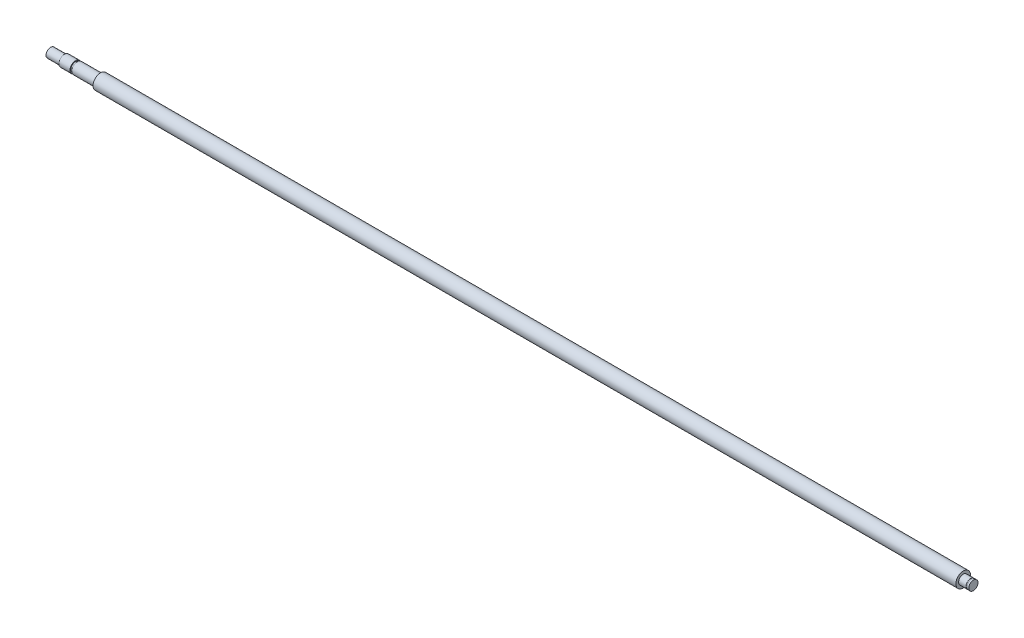
ISO-10303-21;
HEADER;
FILE_DESCRIPTION(('STEP AP214'),'2;1');
FILE_NAME('part.step','',(''),(''),'','','');
FILE_SCHEMA(('AUTOMOTIVE_DESIGN { 1 0 10303 214 1 1 1 1 }'));
ENDSEC;
DATA;
#1=APPLICATION_CONTEXT('core data for automotive mechanical design processes');
#2=APPLICATION_PROTOCOL_DEFINITION('international standard','automotive_design',2000,#1);
#3=PRODUCT_CONTEXT('',#1,'mechanical');
#4=PRODUCT('Part','Part','',(#3));
#5=PRODUCT_RELATED_PRODUCT_CATEGORY('part','',(#4));
#6=PRODUCT_DEFINITION_FORMATION('','',#4);
#7=PRODUCT_DEFINITION_CONTEXT('part definition',#1,'design');
#8=PRODUCT_DEFINITION('design','',#6,#7);
#9=PRODUCT_DEFINITION_SHAPE('','',#8);
#10=(LENGTH_UNIT() NAMED_UNIT(*) SI_UNIT(.MILLI.,.METRE.));
#11=(NAMED_UNIT(*) PLANE_ANGLE_UNIT() SI_UNIT($,.RADIAN.));
#12=(NAMED_UNIT(*) SI_UNIT($,.STERADIAN.) SOLID_ANGLE_UNIT());
#13=UNCERTAINTY_MEASURE_WITH_UNIT(LENGTH_MEASURE(1.E-05),#10,'distance_accuracy_value','');
#14=(GEOMETRIC_REPRESENTATION_CONTEXT(3) GLOBAL_UNCERTAINTY_ASSIGNED_CONTEXT((#13)) GLOBAL_UNIT_ASSIGNED_CONTEXT((#10,
#11,#12)) REPRESENTATION_CONTEXT('',''));
#15=CARTESIAN_POINT('',(0.,0.,0.));
#16=DIRECTION('',(0.,0.,1.));
#17=DIRECTION('',(1.,0.,0.));
#18=AXIS2_PLACEMENT_3D('',#15,#16,#17);
#19=CARTESIAN_POINT('',(-54.,5.00000000000005,0.));
#20=DIRECTION('',(1.,0.,0.));
#21=DIRECTION('',(0.,0.,-1.));
#22=AXIS2_PLACEMENT_3D('',#19,#20,#21);
#23=PLANE('',#22);
#24=CARTESIAN_POINT('',(-54.,0.,0.));
#25=DIRECTION('',(-1.,0.,0.));
#26=DIRECTION('',(0.,0.,1.));
#27=AXIS2_PLACEMENT_3D('',#24,#25,#26);
#28=CIRCLE('',#27,5.00000000000005);
#29=CARTESIAN_POINT('',(-54.,0.,5.00000000000005));
#30=VERTEX_POINT('',#29);
#31=EDGE_CURVE('E87',#30,#30,#28,.T.);
#32=ORIENTED_EDGE('',*,*,#31,.T.);
#33=EDGE_LOOP('',(#32));
#34=FACE_BOUND('',#33,.T.);
#35=ADVANCED_FACE('F35',(#34),#23,.F.);
#36=CARTESIAN_POINT('',(946.,0.,0.));
#37=DIRECTION('',(-1.,0.,0.));
#38=DIRECTION('',(0.,0.,1.));
#39=AXIS2_PLACEMENT_3D('',#36,#37,#38);
#40=PLANE('',#39);
#41=CARTESIAN_POINT('',(946.,0.,0.));
#42=DIRECTION('',(-1.,0.,0.));
#43=DIRECTION('',(0.,0.,1.));
#44=AXIS2_PLACEMENT_3D('',#41,#42,#43);
#45=CIRCLE('',#44,5.00000000000017);
#46=CARTESIAN_POINT('',(946.,0.,5.00000000000017));
#47=VERTEX_POINT('',#46);
#48=EDGE_CURVE('E10',#47,#47,#45,.T.);
#49=ORIENTED_EDGE('',*,*,#48,.F.);
#50=EDGE_LOOP('',(#49));
#51=FACE_BOUND('',#50,.T.);
#52=ADVANCED_FACE('F177',(#51),#40,.F.);
#53=CARTESIAN_POINT('',(-54.,0.,0.));
#54=DIRECTION('',(-1.,0.,0.));
#55=DIRECTION('',(0.,0.,1.));
#56=AXIS2_PLACEMENT_3D('',#53,#54,#55);
#57=CYLINDRICAL_SURFACE('',#56,5.00000000000017);
#58=CARTESIAN_POINT('',(944.15,0.,0.));
#59=DIRECTION('',(-1.,0.,0.));
#60=DIRECTION('',(0.,0.,1.));
#61=AXIS2_PLACEMENT_3D('',#58,#59,#60);
#62=CIRCLE('',#61,5.00000000000017);
#63=CARTESIAN_POINT('',(944.15,0.,5.00000000000017));
#64=VERTEX_POINT('',#63);
#65=EDGE_CURVE('E41',#64,#64,#62,.T.);
#66=ORIENTED_EDGE('',*,*,#65,.F.);
#67=EDGE_LOOP('',(#66));
#68=FACE_BOUND('',#67,.T.);
#69=ORIENTED_EDGE('',*,*,#48,.T.);
#70=EDGE_LOOP('',(#69));
#71=FACE_BOUND('',#70,.T.);
#72=ADVANCED_FACE('F172',(#68,#71),#57,.T.);
#73=CARTESIAN_POINT('',(944.15,5.00000000000017,0.));
#74=DIRECTION('',(1.,0.,0.));
#75=DIRECTION('',(0.,0.,-1.));
#76=AXIS2_PLACEMENT_3D('',#73,#74,#75);
#77=PLANE('',#76);
#78=CARTESIAN_POINT('',(944.15,0.,0.));
#79=DIRECTION('',(-1.,0.,0.));
#80=DIRECTION('',(0.,0.,1.));
#81=AXIS2_PLACEMENT_3D('',#78,#79,#80);
#82=CIRCLE('',#81,4.80000000000012);
#83=CARTESIAN_POINT('',(944.15,0.,4.80000000000012));
#84=VERTEX_POINT('',#83);
#85=EDGE_CURVE('E45',#84,#84,#82,.T.);
#86=ORIENTED_EDGE('',*,*,#85,.F.);
#87=EDGE_LOOP('',(#86));
#88=FACE_BOUND('',#87,.T.);
#89=ORIENTED_EDGE('',*,*,#65,.T.);
#90=EDGE_LOOP('',(#89));
#91=FACE_BOUND('',#90,.T.);
#92=ADVANCED_FACE('F167',(#88,#91),#77,.F.);
#93=CARTESIAN_POINT('',(-54.,0.,0.));
#94=DIRECTION('',(-1.,0.,0.));
#95=DIRECTION('',(0.,0.,1.));
#96=AXIS2_PLACEMENT_3D('',#93,#94,#95);
#97=CYLINDRICAL_SURFACE('',#96,4.80000000000012);
#98=CARTESIAN_POINT('',(943.,0.,0.));
#99=DIRECTION('',(-1.,0.,0.));
#100=DIRECTION('',(0.,0.,1.));
#101=AXIS2_PLACEMENT_3D('',#98,#99,#100);
#102=CIRCLE('',#101,4.80000000000012);
#103=CARTESIAN_POINT('',(943.,0.,4.80000000000012));
#104=VERTEX_POINT('',#103);
#105=EDGE_CURVE('E49',#104,#104,#102,.T.);
#106=ORIENTED_EDGE('',*,*,#105,.F.);
#107=EDGE_LOOP('',(#106));
#108=FACE_BOUND('',#107,.T.);
#109=ORIENTED_EDGE('',*,*,#85,.T.);
#110=EDGE_LOOP('',(#109));
#111=FACE_BOUND('',#110,.T.);
#112=ADVANCED_FACE('F161',(#108,#111),#97,.T.);
#113=CARTESIAN_POINT('',(943.,4.80000000000012,0.));
#114=DIRECTION('',(-1.,0.,0.));
#115=DIRECTION('',(0.,0.,1.));
#116=AXIS2_PLACEMENT_3D('',#113,#114,#115);
#117=PLANE('',#116);
#118=CARTESIAN_POINT('',(943.,0.,0.));
#119=DIRECTION('',(-1.,0.,0.));
#120=DIRECTION('',(0.,0.,1.));
#121=AXIS2_PLACEMENT_3D('',#118,#119,#120);
#122=CIRCLE('',#121,5.00000000000017);
#123=CARTESIAN_POINT('',(943.,0.,5.00000000000017));
#124=VERTEX_POINT('',#123);
#125=EDGE_CURVE('E54',#124,#124,#122,.T.);
#126=ORIENTED_EDGE('',*,*,#125,.F.);
#127=EDGE_LOOP('',(#126));
#128=FACE_BOUND('',#127,.T.);
#129=ORIENTED_EDGE('',*,*,#105,.T.);
#130=EDGE_LOOP('',(#129));
#131=FACE_BOUND('',#130,.T.);
#132=ADVANCED_FACE('F155',(#128,#131),#117,.F.);
#133=CARTESIAN_POINT('',(-54.,0.,0.));
#134=DIRECTION('',(-1.,0.,0.));
#135=DIRECTION('',(0.,0.,1.));
#136=AXIS2_PLACEMENT_3D('',#133,#134,#135);
#137=CYLINDRICAL_SURFACE('',#136,5.00000000000017);
#138=CARTESIAN_POINT('',(935.,0.,0.));
#139=DIRECTION('',(-1.,0.,0.));
#140=DIRECTION('',(0.,0.,1.));
#141=AXIS2_PLACEMENT_3D('',#138,#139,#140);
#142=CIRCLE('',#141,5.00000000000017);
#143=CARTESIAN_POINT('',(935.,0.,5.00000000000017));
#144=VERTEX_POINT('',#143);
#145=EDGE_CURVE('E57',#144,#144,#142,.T.);
#146=ORIENTED_EDGE('',*,*,#145,.F.);
#147=EDGE_LOOP('',(#146));
#148=FACE_BOUND('',#147,.T.);
#149=ORIENTED_EDGE('',*,*,#125,.T.);
#150=EDGE_LOOP('',(#149));
#151=FACE_BOUND('',#150,.T.);
#152=ADVANCED_FACE('F149',(#148,#151),#137,.T.);
#153=CARTESIAN_POINT('',(935.,5.00000000000017,0.));
#154=DIRECTION('',(-1.,0.,0.));
#155=DIRECTION('',(0.,0.,1.));
#156=AXIS2_PLACEMENT_3D('',#153,#154,#155);
#157=PLANE('',#156);
#158=CARTESIAN_POINT('',(935.,0.,0.));
#159=DIRECTION('',(-1.,0.,0.));
#160=DIRECTION('',(0.,0.,1.));
#161=AXIS2_PLACEMENT_3D('',#158,#159,#160);
#162=CIRCLE('',#161,8.00000000000005);
#163=CARTESIAN_POINT('',(935.,0.,8.00000000000005));
#164=VERTEX_POINT('',#163);
#165=EDGE_CURVE('E60',#164,#164,#162,.T.);
#166=ORIENTED_EDGE('',*,*,#165,.F.);
#167=EDGE_LOOP('',(#166));
#168=FACE_BOUND('',#167,.T.);
#169=ORIENTED_EDGE('',*,*,#145,.T.);
#170=EDGE_LOOP('',(#169));
#171=FACE_BOUND('',#170,.T.);
#172=ADVANCED_FACE('F143',(#168,#171),#157,.F.);
#173=CARTESIAN_POINT('',(-54.,0.,0.));
#174=DIRECTION('',(-1.,0.,0.));
#175=DIRECTION('',(0.,0.,1.));
#176=AXIS2_PLACEMENT_3D('',#173,#174,#175);
#177=CYLINDRICAL_SURFACE('',#176,8.);
#178=CARTESIAN_POINT('',(0.,0.,0.));
#179=DIRECTION('',(-1.,0.,0.));
#180=DIRECTION('',(0.,0.,1.));
#181=AXIS2_PLACEMENT_3D('',#178,#179,#180);
#182=CIRCLE('',#181,7.99999999999994);
#183=CARTESIAN_POINT('',(0.,0.,7.99999999999994));
#184=VERTEX_POINT('',#183);
#185=EDGE_CURVE('E63',#184,#184,#182,.T.);
#186=ORIENTED_EDGE('',*,*,#185,.F.);
#187=EDGE_LOOP('',(#186));
#188=FACE_BOUND('',#187,.T.);
#189=ORIENTED_EDGE('',*,*,#165,.T.);
#190=EDGE_LOOP('',(#189));
#191=FACE_BOUND('',#190,.T.);
#192=ADVANCED_FACE('F137',(#188,#191),#177,.T.);
#193=CARTESIAN_POINT('',(0.,7.99999999999994,0.));
#194=DIRECTION('',(1.,0.,0.));
#195=DIRECTION('',(0.,0.,-1.));
#196=AXIS2_PLACEMENT_3D('',#193,#194,#195);
#197=PLANE('',#196);
#198=CARTESIAN_POINT('',(0.,0.,0.));
#199=DIRECTION('',(-1.,0.,0.));
#200=DIRECTION('',(0.,0.,1.));
#201=AXIS2_PLACEMENT_3D('',#198,#199,#200);
#202=CIRCLE('',#201,6.00000000000006);
#203=CARTESIAN_POINT('',(0.,0.,6.00000000000006));
#204=VERTEX_POINT('',#203);
#205=EDGE_CURVE('E66',#204,#204,#202,.T.);
#206=ORIENTED_EDGE('',*,*,#205,.F.);
#207=EDGE_LOOP('',(#206));
#208=FACE_BOUND('',#207,.T.);
#209=ORIENTED_EDGE('',*,*,#185,.T.);
#210=EDGE_LOOP('',(#209));
#211=FACE_BOUND('',#210,.T.);
#212=ADVANCED_FACE('F131',(#208,#211),#197,.F.);
#213=CARTESIAN_POINT('',(-54.,0.,0.));
#214=DIRECTION('',(-1.,0.,0.));
#215=DIRECTION('',(0.,0.,1.));
#216=AXIS2_PLACEMENT_3D('',#213,#214,#215);
#217=CYLINDRICAL_SURFACE('',#216,6.00000000000006);
#218=CARTESIAN_POINT('',(-25.,0.,0.));
#219=DIRECTION('',(-1.,0.,0.));
#220=DIRECTION('',(0.,0.,1.));
#221=AXIS2_PLACEMENT_3D('',#218,#219,#220);
#222=CIRCLE('',#221,6.00000000000006);
#223=CARTESIAN_POINT('',(-25.,0.,6.00000000000006));
#224=VERTEX_POINT('',#223);
#225=EDGE_CURVE('E69',#224,#224,#222,.T.);
#226=ORIENTED_EDGE('',*,*,#225,.F.);
#227=EDGE_LOOP('',(#226));
#228=FACE_BOUND('',#227,.T.);
#229=ORIENTED_EDGE('',*,*,#205,.T.);
#230=EDGE_LOOP('',(#229));
#231=FACE_BOUND('',#230,.T.);
#232=ADVANCED_FACE('F125',(#228,#231),#217,.T.);
#233=CARTESIAN_POINT('',(-25.,6.00000000000006,0.));
#234=DIRECTION('',(1.,0.,0.));
#235=DIRECTION('',(0.,0.,-1.));
#236=AXIS2_PLACEMENT_3D('',#233,#234,#235);
#237=PLANE('',#236);
#238=CARTESIAN_POINT('',(-25.,0.,0.));
#239=DIRECTION('',(-1.,0.,0.));
#240=DIRECTION('',(0.,0.,1.));
#241=AXIS2_PLACEMENT_3D('',#238,#239,#240);
#242=CIRCLE('',#241,5.00000000000006);
#243=CARTESIAN_POINT('',(-25.,0.,5.00000000000006));
#244=VERTEX_POINT('',#243);
#245=EDGE_CURVE('E72',#244,#244,#242,.T.);
#246=ORIENTED_EDGE('',*,*,#245,.F.);
#247=EDGE_LOOP('',(#246));
#248=FACE_BOUND('',#247,.T.);
#249=ORIENTED_EDGE('',*,*,#225,.T.);
#250=EDGE_LOOP('',(#249));
#251=FACE_BOUND('',#250,.T.);
#252=ADVANCED_FACE('F119',(#248,#251),#237,.F.);
#253=CARTESIAN_POINT('',(-54.,0.,0.));
#254=DIRECTION('',(-1.,0.,0.));
#255=DIRECTION('',(0.,0.,1.));
#256=AXIS2_PLACEMENT_3D('',#253,#254,#255);
#257=CYLINDRICAL_SURFACE('',#256,5.00000000000006);
#258=CARTESIAN_POINT('',(-27.,0.,0.));
#259=DIRECTION('',(-1.,0.,0.));
#260=DIRECTION('',(0.,0.,1.));
#261=AXIS2_PLACEMENT_3D('',#258,#259,#260);
#262=CIRCLE('',#261,5.00000000000006);
#263=CARTESIAN_POINT('',(-27.,0.,5.00000000000006));
#264=VERTEX_POINT('',#263);
#265=EDGE_CURVE('E75',#264,#264,#262,.T.);
#266=ORIENTED_EDGE('',*,*,#265,.F.);
#267=EDGE_LOOP('',(#266));
#268=FACE_BOUND('',#267,.T.);
#269=ORIENTED_EDGE('',*,*,#245,.T.);
#270=EDGE_LOOP('',(#269));
#271=FACE_BOUND('',#270,.T.);
#272=ADVANCED_FACE('F113',(#268,#271),#257,.T.);
#273=CARTESIAN_POINT('',(-27.,5.00000000000006,0.));
#274=DIRECTION('',(-1.,0.,0.));
#275=DIRECTION('',(0.,0.,1.));
#276=AXIS2_PLACEMENT_3D('',#273,#274,#275);
#277=PLANE('',#276);
#278=CARTESIAN_POINT('',(-27.,0.,0.));
#279=DIRECTION('',(-1.,0.,0.));
#280=DIRECTION('',(0.,0.,1.));
#281=AXIS2_PLACEMENT_3D('',#278,#279,#280);
#282=CIRCLE('',#281,6.00000000000005);
#283=CARTESIAN_POINT('',(-27.,0.,6.00000000000005));
#284=VERTEX_POINT('',#283);
#285=EDGE_CURVE('E78',#284,#284,#282,.T.);
#286=ORIENTED_EDGE('',*,*,#285,.F.);
#287=EDGE_LOOP('',(#286));
#288=FACE_BOUND('',#287,.T.);
#289=ORIENTED_EDGE('',*,*,#265,.T.);
#290=EDGE_LOOP('',(#289));
#291=FACE_BOUND('',#290,.T.);
#292=ADVANCED_FACE('F107',(#288,#291),#277,.F.);
#293=CARTESIAN_POINT('',(-54.,0.,0.));
#294=DIRECTION('',(-1.,0.,0.));
#295=DIRECTION('',(0.,0.,1.));
#296=AXIS2_PLACEMENT_3D('',#293,#294,#295);
#297=CYLINDRICAL_SURFACE('',#296,6.00000000000005);
#298=CARTESIAN_POINT('',(-39.,0.,0.));
#299=DIRECTION('',(-1.,0.,0.));
#300=DIRECTION('',(0.,0.,1.));
#301=AXIS2_PLACEMENT_3D('',#298,#299,#300);
#302=CIRCLE('',#301,6.00000000000005);
#303=CARTESIAN_POINT('',(-39.,0.,6.00000000000005));
#304=VERTEX_POINT('',#303);
#305=EDGE_CURVE('E81',#304,#304,#302,.T.);
#306=ORIENTED_EDGE('',*,*,#305,.F.);
#307=EDGE_LOOP('',(#306));
#308=FACE_BOUND('',#307,.T.);
#309=ORIENTED_EDGE('',*,*,#285,.T.);
#310=EDGE_LOOP('',(#309));
#311=FACE_BOUND('',#310,.T.);
#312=ADVANCED_FACE('F101',(#308,#311),#297,.T.);
#313=CARTESIAN_POINT('',(-39.,6.00000000000005,0.));
#314=DIRECTION('',(1.,0.,0.));
#315=DIRECTION('',(0.,0.,-1.));
#316=AXIS2_PLACEMENT_3D('',#313,#314,#315);
#317=PLANE('',#316);
#318=CARTESIAN_POINT('',(-39.,0.,0.));
#319=DIRECTION('',(-1.,0.,0.));
#320=DIRECTION('',(0.,0.,1.));
#321=AXIS2_PLACEMENT_3D('',#318,#319,#320);
#322=CIRCLE('',#321,5.00000000000006);
#323=CARTESIAN_POINT('',(-39.,0.,5.00000000000006));
#324=VERTEX_POINT('',#323);
#325=EDGE_CURVE('E84',#324,#324,#322,.T.);
#326=ORIENTED_EDGE('',*,*,#325,.F.);
#327=EDGE_LOOP('',(#326));
#328=FACE_BOUND('',#327,.T.);
#329=ORIENTED_EDGE('',*,*,#305,.T.);
#330=EDGE_LOOP('',(#329));
#331=FACE_BOUND('',#330,.T.);
#332=ADVANCED_FACE('F95',(#328,#331),#317,.F.);
#333=CARTESIAN_POINT('',(-54.,0.,0.));
#334=DIRECTION('',(-1.,0.,0.));
#335=DIRECTION('',(0.,0.,1.));
#336=AXIS2_PLACEMENT_3D('',#333,#334,#335);
#337=CYLINDRICAL_SURFACE('',#336,5.00000000000005);
#338=ORIENTED_EDGE('',*,*,#31,.F.);
#339=EDGE_LOOP('',(#338));
#340=FACE_BOUND('',#339,.T.);
#341=ORIENTED_EDGE('',*,*,#325,.T.);
#342=EDGE_LOOP('',(#341));
#343=FACE_BOUND('',#342,.T.);
#344=ADVANCED_FACE('F92',(#340,#343),#337,.T.);
#345=CLOSED_SHELL('',(#35,#52,#72,#92,#112,#132,#152,#172,#192,#212,#232,#252,#272,#292,#312,
#332,#344));
#346=MANIFOLD_SOLID_BREP('B2',#345);
#347=ADVANCED_BREP_SHAPE_REPRESENTATION('',(#18,#346),#14);
#348=SHAPE_DEFINITION_REPRESENTATION(#9,#347);
ENDSEC;
END-ISO-10303-21;
